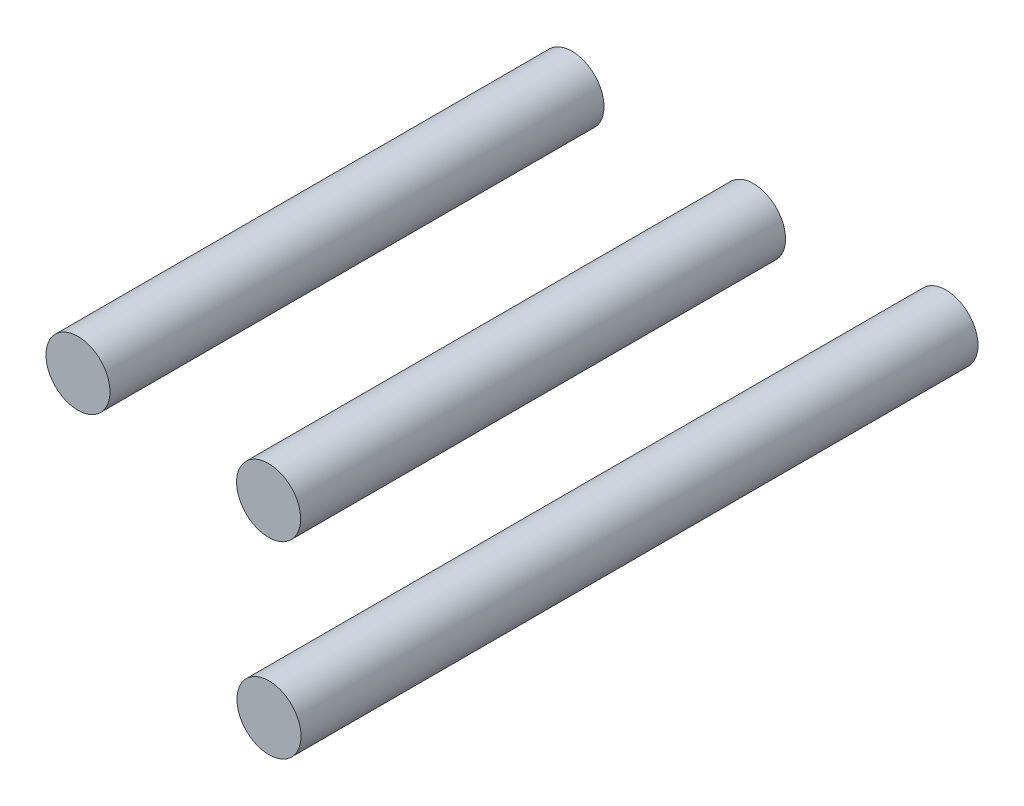
ISO-10303-21;
HEADER;
FILE_DESCRIPTION(('STEP AP214'),'2;1');
FILE_NAME('part.step','',(''),(''),'','','');
FILE_SCHEMA(('AUTOMOTIVE_DESIGN { 1 0 10303 214 1 1 1 1 }'));
ENDSEC;
DATA;
#1=APPLICATION_CONTEXT('core data for automotive mechanical design processes');
#2=APPLICATION_PROTOCOL_DEFINITION('international standard','automotive_design',2000,#1);
#3=PRODUCT_CONTEXT('',#1,'mechanical');
#4=PRODUCT('Part','Part','',(#3));
#5=PRODUCT_RELATED_PRODUCT_CATEGORY('part','',(#4));
#6=PRODUCT_DEFINITION_FORMATION('','',#4);
#7=PRODUCT_DEFINITION_CONTEXT('part definition',#1,'design');
#8=PRODUCT_DEFINITION('design','',#6,#7);
#9=PRODUCT_DEFINITION_SHAPE('','',#8);
#10=(LENGTH_UNIT() NAMED_UNIT(*) SI_UNIT(.MILLI.,.METRE.));
#11=(NAMED_UNIT(*) PLANE_ANGLE_UNIT() SI_UNIT($,.RADIAN.));
#12=(NAMED_UNIT(*) SI_UNIT($,.STERADIAN.) SOLID_ANGLE_UNIT());
#13=UNCERTAINTY_MEASURE_WITH_UNIT(LENGTH_MEASURE(1.E-05),#10,'distance_accuracy_value','');
#14=(GEOMETRIC_REPRESENTATION_CONTEXT(3) GLOBAL_UNCERTAINTY_ASSIGNED_CONTEXT((#13)) GLOBAL_UNIT_ASSIGNED_CONTEXT((#10,
#11,#12)) REPRESENTATION_CONTEXT('',''));
#15=CARTESIAN_POINT('',(0.,0.,0.));
#16=DIRECTION('',(0.,0.,1.));
#17=DIRECTION('',(1.,0.,0.));
#18=AXIS2_PLACEMENT_3D('',#15,#16,#17);
#19=CARTESIAN_POINT('',(-20.2737107628792,-7.45760574702103,74.));
#20=DIRECTION('',(0.,0.,-1.));
#21=DIRECTION('',(-1.,0.,0.));
#22=AXIS2_PLACEMENT_3D('',#19,#20,#21);
#23=CYLINDRICAL_SURFACE('',#22,3.5);
#24=CARTESIAN_POINT('',(-20.2737107628792,-7.45760574702103,74.));
#25=DIRECTION('',(0.,0.,1.));
#26=DIRECTION('',(1.,0.,0.));
#27=AXIS2_PLACEMENT_3D('',#24,#25,#26);
#28=CIRCLE('',#27,3.5);
#29=CARTESIAN_POINT('',(-16.7737107628792,-7.45760574702103,74.));
#30=VERTEX_POINT('',#29);
#31=EDGE_CURVE('E11',#30,#30,#28,.T.);
#32=ORIENTED_EDGE('',*,*,#31,.F.);
#33=EDGE_LOOP('',(#32));
#34=FACE_BOUND('',#33,.T.);
#35=CARTESIAN_POINT('',(-20.2737107628792,-7.45760574702103,0.));
#36=DIRECTION('',(0.,0.,1.));
#37=DIRECTION('',(1.,0.,0.));
#38=AXIS2_PLACEMENT_3D('',#35,#36,#37);
#39=CIRCLE('',#38,3.5);
#40=CARTESIAN_POINT('',(-16.7737107628792,-7.45760574702103,0.));
#41=VERTEX_POINT('',#40);
#42=EDGE_CURVE('E43',#41,#41,#39,.T.);
#43=ORIENTED_EDGE('',*,*,#42,.T.);
#44=EDGE_LOOP('',(#43));
#45=FACE_BOUND('',#44,.T.);
#46=ADVANCED_FACE('F40',(#34,#45),#23,.T.);
#47=CARTESIAN_POINT('',(-20.2737107628792,-7.45760574702103,74.));
#48=DIRECTION('',(0.,0.,1.));
#49=DIRECTION('',(1.,0.,0.));
#50=AXIS2_PLACEMENT_3D('',#47,#48,#49);
#51=PLANE('',#50);
#52=ORIENTED_EDGE('',*,*,#31,.T.);
#53=EDGE_LOOP('',(#52));
#54=FACE_BOUND('',#53,.T.);
#55=ADVANCED_FACE('F55',(#54),#51,.T.);
#56=CARTESIAN_POINT('',(-20.2737107628792,-7.45760574702103,0.));
#57=DIRECTION('',(0.,0.,1.));
#58=DIRECTION('',(1.,0.,0.));
#59=AXIS2_PLACEMENT_3D('',#56,#57,#58);
#60=PLANE('',#59);
#61=ORIENTED_EDGE('',*,*,#42,.F.);
#62=EDGE_LOOP('',(#61));
#63=FACE_BOUND('',#62,.T.);
#64=ADVANCED_FACE('F53',(#63),#60,.F.);
#65=CLOSED_SHELL('',(#46,#55,#64));
#66=MANIFOLD_SOLID_BREP('B2',#65);
#67=CARTESIAN_POINT('',(-41.3151167442116,-7.90545439674872,53.));
#68=DIRECTION('',(0.,0.,-1.));
#69=DIRECTION('',(-1.,0.,0.));
#70=AXIS2_PLACEMENT_3D('',#67,#68,#69);
#71=CYLINDRICAL_SURFACE('',#70,3.5);
#72=CARTESIAN_POINT('',(-41.3151167442116,-7.90545439674872,53.));
#73=DIRECTION('',(0.,0.,1.));
#74=DIRECTION('',(1.,0.,0.));
#75=AXIS2_PLACEMENT_3D('',#72,#73,#74);
#76=CIRCLE('',#75,3.5);
#77=CARTESIAN_POINT('',(-37.8151167442116,-7.90545439674872,53.));
#78=VERTEX_POINT('',#77);
#79=EDGE_CURVE('E39',#78,#78,#76,.T.);
#80=ORIENTED_EDGE('',*,*,#79,.F.);
#81=EDGE_LOOP('',(#80));
#82=FACE_BOUND('',#81,.T.);
#83=CARTESIAN_POINT('',(-41.3151167442116,-7.90545439674872,0.));
#84=DIRECTION('',(0.,0.,1.));
#85=DIRECTION('',(1.,0.,0.));
#86=AXIS2_PLACEMENT_3D('',#83,#84,#85);
#87=CIRCLE('',#86,3.5);
#88=CARTESIAN_POINT('',(-37.8151167442116,-7.90545439674872,0.));
#89=VERTEX_POINT('',#88);
#90=EDGE_CURVE('E91',#89,#89,#87,.T.);
#91=ORIENTED_EDGE('',*,*,#90,.T.);
#92=EDGE_LOOP('',(#91));
#93=FACE_BOUND('',#92,.T.);
#94=ADVANCED_FACE('F88',(#82,#93),#71,.T.);
#95=CARTESIAN_POINT('',(-41.3151167442116,-7.90545439674872,53.));
#96=DIRECTION('',(0.,0.,1.));
#97=DIRECTION('',(1.,0.,0.));
#98=AXIS2_PLACEMENT_3D('',#95,#96,#97);
#99=PLANE('',#98);
#100=ORIENTED_EDGE('',*,*,#79,.T.);
#101=EDGE_LOOP('',(#100));
#102=FACE_BOUND('',#101,.T.);
#103=ADVANCED_FACE('F103',(#102),#99,.T.);
#104=CARTESIAN_POINT('',(-41.3151167442116,-7.90545439674872,0.));
#105=DIRECTION('',(0.,0.,1.));
#106=DIRECTION('',(1.,0.,0.));
#107=AXIS2_PLACEMENT_3D('',#104,#105,#106);
#108=PLANE('',#107);
#109=ORIENTED_EDGE('',*,*,#90,.F.);
#110=EDGE_LOOP('',(#109));
#111=FACE_BOUND('',#110,.T.);
#112=ADVANCED_FACE('F101',(#111),#108,.F.);
#113=CLOSED_SHELL('',(#94,#103,#112));
#114=MANIFOLD_SOLID_BREP('B6',#113);
#115=CARTESIAN_POINT('',(-61.1521957405066,-5.29201693908231,54.));
#116=DIRECTION('',(0.,0.,-1.));
#117=DIRECTION('',(-1.,0.,0.));
#118=AXIS2_PLACEMENT_3D('',#115,#116,#117);
#119=CYLINDRICAL_SURFACE('',#118,3.5);
#120=CARTESIAN_POINT('',(-61.1521957405066,-5.29201693908231,54.));
#121=DIRECTION('',(0.,0.,1.));
#122=DIRECTION('',(1.,0.,0.));
#123=AXIS2_PLACEMENT_3D('',#120,#121,#122);
#124=CIRCLE('',#123,3.5);
#125=CARTESIAN_POINT('',(-57.6521957405066,-5.29201693908231,54.));
#126=VERTEX_POINT('',#125);
#127=EDGE_CURVE('E87',#126,#126,#124,.T.);
#128=ORIENTED_EDGE('',*,*,#127,.F.);
#129=EDGE_LOOP('',(#128));
#130=FACE_BOUND('',#129,.T.);
#131=CARTESIAN_POINT('',(-61.1521957405066,-5.29201693908231,0.));
#132=DIRECTION('',(0.,0.,1.));
#133=DIRECTION('',(1.,0.,0.));
#134=AXIS2_PLACEMENT_3D('',#131,#132,#133);
#135=CIRCLE('',#134,3.5);
#136=CARTESIAN_POINT('',(-57.6521957405066,-5.29201693908231,0.));
#137=VERTEX_POINT('',#136);
#138=EDGE_CURVE('E132',#137,#137,#135,.T.);
#139=ORIENTED_EDGE('',*,*,#138,.T.);
#140=EDGE_LOOP('',(#139));
#141=FACE_BOUND('',#140,.T.);
#142=ADVANCED_FACE('F129',(#130,#141),#119,.T.);
#143=CARTESIAN_POINT('',(-61.1521957405066,-5.29201693908231,54.));
#144=DIRECTION('',(0.,0.,1.));
#145=DIRECTION('',(1.,0.,0.));
#146=AXIS2_PLACEMENT_3D('',#143,#144,#145);
#147=PLANE('',#146);
#148=ORIENTED_EDGE('',*,*,#127,.T.);
#149=EDGE_LOOP('',(#148));
#150=FACE_BOUND('',#149,.T.);
#151=ADVANCED_FACE('F144',(#150),#147,.T.);
#152=CARTESIAN_POINT('',(-61.1521957405066,-5.29201693908231,0.));
#153=DIRECTION('',(0.,0.,1.));
#154=DIRECTION('',(1.,0.,0.));
#155=AXIS2_PLACEMENT_3D('',#152,#153,#154);
#156=PLANE('',#155);
#157=ORIENTED_EDGE('',*,*,#138,.F.);
#158=EDGE_LOOP('',(#157));
#159=FACE_BOUND('',#158,.T.);
#160=ADVANCED_FACE('F142',(#159),#156,.F.);
#161=CLOSED_SHELL('',(#142,#151,#160));
#162=MANIFOLD_SOLID_BREP('B34',#161);
#163=ADVANCED_BREP_SHAPE_REPRESENTATION('',(#18,#66,#114,#162),#14);
#164=SHAPE_DEFINITION_REPRESENTATION(#9,#163);
ENDSEC;
END-ISO-10303-21;
